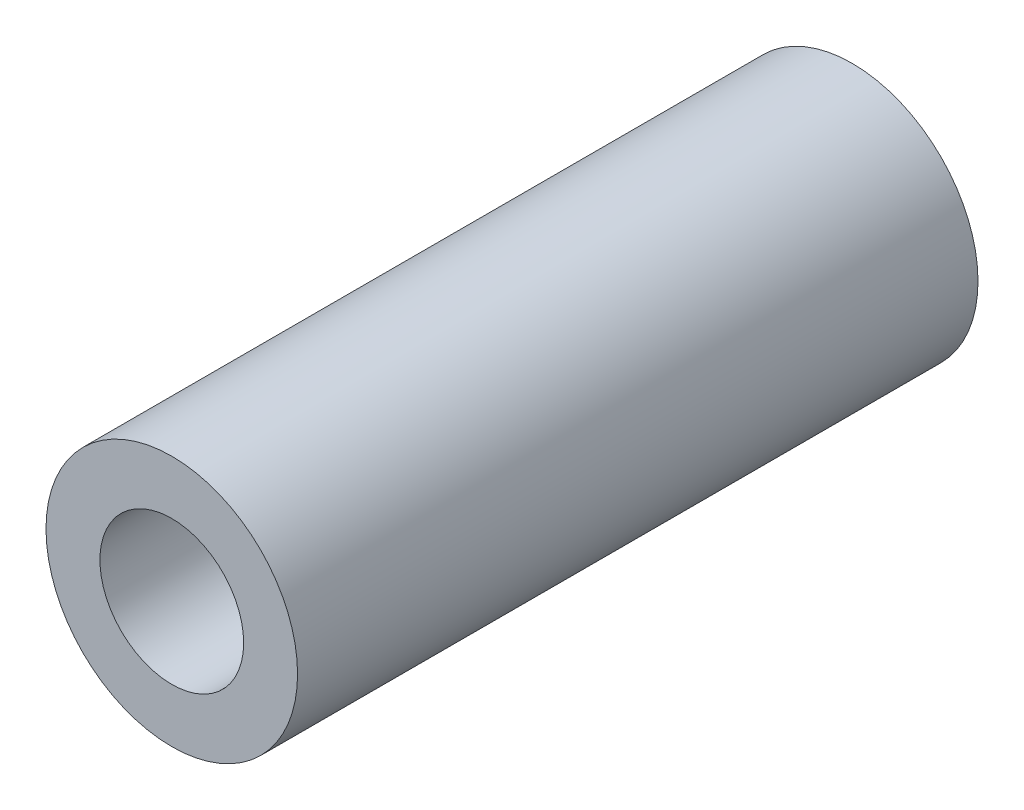
ISO-10303-21;
HEADER;
FILE_DESCRIPTION(('STEP AP214'),'2;1');
FILE_NAME('part.step','',(''),(''),'','','');
FILE_SCHEMA(('AUTOMOTIVE_DESIGN { 1 0 10303 214 1 1 1 1 }'));
ENDSEC;
DATA;
#1=APPLICATION_CONTEXT('core data for automotive mechanical design processes');
#2=APPLICATION_PROTOCOL_DEFINITION('international standard','automotive_design',2000,#1);
#3=PRODUCT_CONTEXT('',#1,'mechanical');
#4=PRODUCT('Part','Part','',(#3));
#5=PRODUCT_RELATED_PRODUCT_CATEGORY('part','',(#4));
#6=PRODUCT_DEFINITION_FORMATION('','',#4);
#7=PRODUCT_DEFINITION_CONTEXT('part definition',#1,'design');
#8=PRODUCT_DEFINITION('design','',#6,#7);
#9=PRODUCT_DEFINITION_SHAPE('','',#8);
#10=(LENGTH_UNIT() NAMED_UNIT(*) SI_UNIT(.MILLI.,.METRE.));
#11=(NAMED_UNIT(*) PLANE_ANGLE_UNIT() SI_UNIT($,.RADIAN.));
#12=(NAMED_UNIT(*) SI_UNIT($,.STERADIAN.) SOLID_ANGLE_UNIT());
#13=UNCERTAINTY_MEASURE_WITH_UNIT(LENGTH_MEASURE(1.E-05),#10,'distance_accuracy_value','');
#14=(GEOMETRIC_REPRESENTATION_CONTEXT(3) GLOBAL_UNCERTAINTY_ASSIGNED_CONTEXT((#13)) GLOBAL_UNIT_ASSIGNED_CONTEXT((#10,
#11,#12)) REPRESENTATION_CONTEXT('',''));
#15=CARTESIAN_POINT('',(0.,0.,0.));
#16=DIRECTION('',(0.,0.,1.));
#17=DIRECTION('',(1.,0.,0.));
#18=AXIS2_PLACEMENT_3D('',#15,#16,#17);
#19=CARTESIAN_POINT('',(0.,0.,56.8));
#20=DIRECTION('',(0.,0.,1.));
#21=DIRECTION('',(1.,0.,0.));
#22=AXIS2_PLACEMENT_3D('',#19,#20,#21);
#23=PLANE('',#22);
#24=CARTESIAN_POINT('',(0.,0.,56.8));
#25=DIRECTION('',(0.,0.,1.));
#26=DIRECTION('',(1.,0.,0.));
#27=AXIS2_PLACEMENT_3D('',#24,#25,#26);
#28=CIRCLE('',#27,10.5);
#29=CARTESIAN_POINT('',(10.5,0.,56.8));
#30=VERTEX_POINT('',#29);
#31=EDGE_CURVE('E10',#30,#30,#28,.T.);
#32=ORIENTED_EDGE('',*,*,#31,.T.);
#33=EDGE_LOOP('',(#32));
#34=FACE_BOUND('',#33,.T.);
#35=CARTESIAN_POINT('',(0.,0.,56.8));
#36=DIRECTION('',(0.,0.,1.));
#37=DIRECTION('',(1.,0.,0.));
#38=AXIS2_PLACEMENT_3D('',#35,#36,#37);
#39=CIRCLE('',#38,6.);
#40=CARTESIAN_POINT('',(6.,0.,56.8));
#41=VERTEX_POINT('',#40);
#42=EDGE_CURVE('E50',#41,#41,#39,.T.);
#43=ORIENTED_EDGE('',*,*,#42,.F.);
#44=EDGE_LOOP('',(#43));
#45=FACE_BOUND('',#44,.T.);
#46=ADVANCED_FACE('F37',(#34,#45),#23,.T.);
#47=CARTESIAN_POINT('',(0.,0.,0.));
#48=DIRECTION('',(0.,0.,1.));
#49=DIRECTION('',(1.,0.,0.));
#50=AXIS2_PLACEMENT_3D('',#47,#48,#49);
#51=PLANE('',#50);
#52=CARTESIAN_POINT('',(0.,0.,0.));
#53=DIRECTION('',(0.,0.,1.));
#54=DIRECTION('',(1.,0.,0.));
#55=AXIS2_PLACEMENT_3D('',#52,#53,#54);
#56=CIRCLE('',#55,10.5);
#57=CARTESIAN_POINT('',(10.5,0.,0.));
#58=VERTEX_POINT('',#57);
#59=EDGE_CURVE('E41',#58,#58,#56,.T.);
#60=ORIENTED_EDGE('',*,*,#59,.F.);
#61=EDGE_LOOP('',(#60));
#62=FACE_BOUND('',#61,.T.);
#63=CARTESIAN_POINT('',(0.,0.,0.));
#64=DIRECTION('',(0.,0.,1.));
#65=DIRECTION('',(1.,0.,0.));
#66=AXIS2_PLACEMENT_3D('',#63,#64,#65);
#67=CIRCLE('',#66,6.);
#68=CARTESIAN_POINT('',(6.,0.,0.));
#69=VERTEX_POINT('',#68);
#70=EDGE_CURVE('E52',#69,#69,#67,.T.);
#71=ORIENTED_EDGE('',*,*,#70,.T.);
#72=EDGE_LOOP('',(#71));
#73=FACE_BOUND('',#72,.T.);
#74=ADVANCED_FACE('F64',(#62,#73),#51,.F.);
#75=CARTESIAN_POINT('',(0.,0.,56.8));
#76=DIRECTION('',(0.,0.,-1.));
#77=DIRECTION('',(-1.,0.,0.));
#78=AXIS2_PLACEMENT_3D('',#75,#76,#77);
#79=CYLINDRICAL_SURFACE('',#78,10.5);
#80=ORIENTED_EDGE('',*,*,#31,.F.);
#81=EDGE_LOOP('',(#80));
#82=FACE_BOUND('',#81,.T.);
#83=ORIENTED_EDGE('',*,*,#59,.T.);
#84=EDGE_LOOP('',(#83));
#85=FACE_BOUND('',#84,.T.);
#86=ADVANCED_FACE('F39',(#82,#85),#79,.T.);
#87=CARTESIAN_POINT('',(0.,0.,56.8));
#88=DIRECTION('',(0.,0.,-1.));
#89=DIRECTION('',(-1.,0.,0.));
#90=AXIS2_PLACEMENT_3D('',#87,#88,#89);
#91=CYLINDRICAL_SURFACE('',#90,6.);
#92=ORIENTED_EDGE('',*,*,#42,.T.);
#93=EDGE_LOOP('',(#92));
#94=FACE_BOUND('',#93,.T.);
#95=ORIENTED_EDGE('',*,*,#70,.F.);
#96=EDGE_LOOP('',(#95));
#97=FACE_BOUND('',#96,.T.);
#98=ADVANCED_FACE('F60',(#94,#97),#91,.F.);
#99=CLOSED_SHELL('',(#46,#74,#86,#98));
#100=MANIFOLD_SOLID_BREP('B2',#99);
#101=ADVANCED_BREP_SHAPE_REPRESENTATION('',(#18,#100),#14);
#102=SHAPE_DEFINITION_REPRESENTATION(#9,#101);
ENDSEC;
END-ISO-10303-21;
